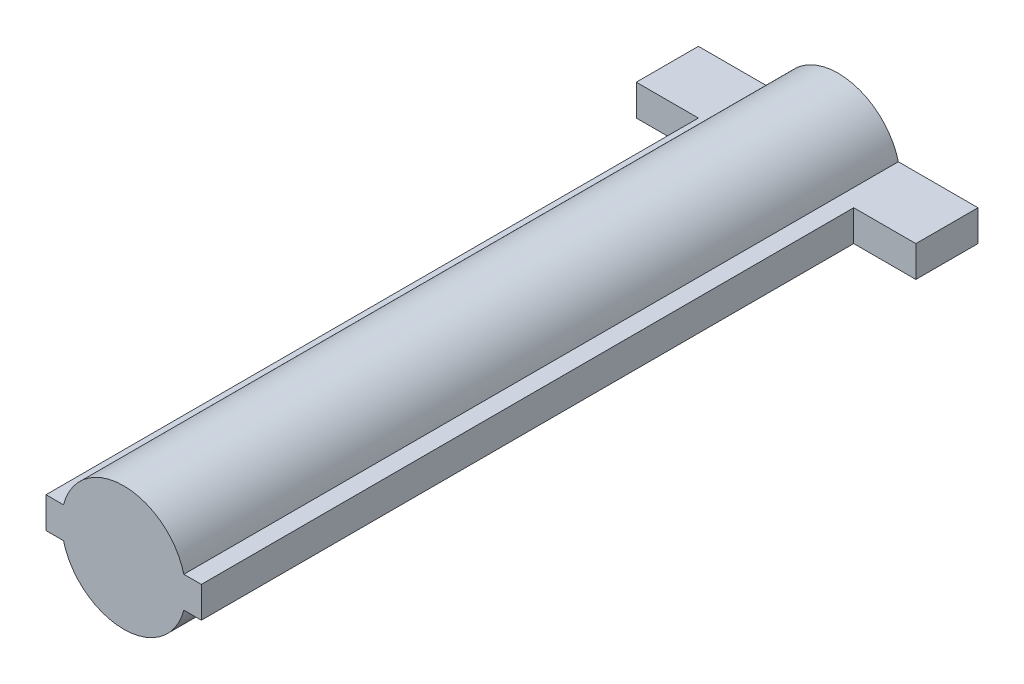
ISO-10303-21;
HEADER;
FILE_DESCRIPTION(('STEP AP214'),'2;1');
FILE_NAME('part.step','',(''),(''),'','','');
FILE_SCHEMA(('AUTOMOTIVE_DESIGN { 1 0 10303 214 1 1 1 1 }'));
ENDSEC;
DATA;
#1=APPLICATION_CONTEXT('core data for automotive mechanical design processes');
#2=APPLICATION_PROTOCOL_DEFINITION('international standard','automotive_design',2000,#1);
#3=PRODUCT_CONTEXT('',#1,'mechanical');
#4=PRODUCT('Part','Part','',(#3));
#5=PRODUCT_RELATED_PRODUCT_CATEGORY('part','',(#4));
#6=PRODUCT_DEFINITION_FORMATION('','',#4);
#7=PRODUCT_DEFINITION_CONTEXT('part definition',#1,'design');
#8=PRODUCT_DEFINITION('design','',#6,#7);
#9=PRODUCT_DEFINITION_SHAPE('','',#8);
#10=(LENGTH_UNIT() NAMED_UNIT(*) SI_UNIT(.MILLI.,.METRE.));
#11=(NAMED_UNIT(*) PLANE_ANGLE_UNIT() SI_UNIT($,.RADIAN.));
#12=(NAMED_UNIT(*) SI_UNIT($,.STERADIAN.) SOLID_ANGLE_UNIT());
#13=UNCERTAINTY_MEASURE_WITH_UNIT(LENGTH_MEASURE(1.E-05),#10,'distance_accuracy_value','');
#14=(GEOMETRIC_REPRESENTATION_CONTEXT(3) GLOBAL_UNCERTAINTY_ASSIGNED_CONTEXT((#13)) GLOBAL_UNIT_ASSIGNED_CONTEXT((#10,
#11,#12)) REPRESENTATION_CONTEXT('',''));
#15=CARTESIAN_POINT('',(0.,0.,0.));
#16=DIRECTION('',(0.,0.,1.));
#17=DIRECTION('',(1.,0.,0.));
#18=AXIS2_PLACEMENT_3D('',#15,#16,#17);
#19=CARTESIAN_POINT('',(0.,0.,2.));
#20=DIRECTION('',(0.,0.,1.));
#21=DIRECTION('',(1.,0.,0.));
#22=AXIS2_PLACEMENT_3D('',#19,#20,#21);
#23=PLANE('',#22);
#24=DIRECTION('',(0.,1.,0.));
#25=VECTOR('',#24,1.);
#26=CARTESIAN_POINT('',(2.5,-0.5,2.));
#27=LINE('',#26,#25);
#28=CARTESIAN_POINT('',(2.5,-0.5,2.));
#29=VERTEX_POINT('',#28);
#30=CARTESIAN_POINT('',(2.5,0.5,2.));
#31=VERTEX_POINT('',#30);
#32=EDGE_CURVE('E146',#29,#31,#27,.T.);
#33=ORIENTED_EDGE('',*,*,#32,.F.);
#34=DIRECTION('',(1.,0.,0.));
#35=VECTOR('',#34,1.);
#36=CARTESIAN_POINT('',(1.93649167310371,-0.5,2.));
#37=LINE('',#36,#35);
#38=CARTESIAN_POINT('',(4.5,-0.500000000000001,2.));
#39=VERTEX_POINT('',#38);
#40=EDGE_CURVE('E172',#29,#39,#37,.T.);
#41=ORIENTED_EDGE('',*,*,#40,.T.);
#42=DIRECTION('',(0.,1.,0.));
#43=VECTOR('',#42,1.);
#44=CARTESIAN_POINT('',(4.5,-0.500000000000001,2.));
#45=LINE('',#44,#43);
#46=CARTESIAN_POINT('',(4.5,0.499999999999999,2.));
#47=VERTEX_POINT('',#46);
#48=EDGE_CURVE('E174',#39,#47,#45,.T.);
#49=ORIENTED_EDGE('',*,*,#48,.T.);
#50=DIRECTION('',(-1.,0.,0.));
#51=VECTOR('',#50,1.);
#52=CARTESIAN_POINT('',(1.93649167310371,0.5,2.));
#53=LINE('',#52,#51);
#54=EDGE_CURVE('E177',#47,#31,#53,.T.);
#55=ORIENTED_EDGE('',*,*,#54,.T.);
#56=EDGE_LOOP('',(#33,#41,#49,#55));
#57=FACE_BOUND('',#56,.T.);
#58=ADVANCED_FACE('F33',(#57),#23,.T.);
#59=CARTESIAN_POINT('',(0.,0.,2.));
#60=DIRECTION('',(0.,0.,-1.));
#61=DIRECTION('',(-1.,0.,0.));
#62=AXIS2_PLACEMENT_3D('',#59,#60,#61);
#63=CYLINDRICAL_SURFACE('',#62,2.);
#64=DIRECTION('',(0.,0.,-1.));
#65=VECTOR('',#64,1.);
#66=CARTESIAN_POINT('',(-1.93649167310371,-0.5,2.));
#67=LINE('',#66,#65);
#68=CARTESIAN_POINT('',(-1.93649167310371,-0.5,23.));
#69=VERTEX_POINT('',#68);
#70=CARTESIAN_POINT('',(-1.93649167310371,-0.5,0.));
#71=VERTEX_POINT('',#70);
#72=EDGE_CURVE('E186',#69,#71,#67,.T.);
#73=ORIENTED_EDGE('',*,*,#72,.T.);
#74=CARTESIAN_POINT('',(0.,0.,0.));
#75=DIRECTION('',(0.,0.,1.));
#76=DIRECTION('',(1.,0.,0.));
#77=AXIS2_PLACEMENT_3D('',#74,#75,#76);
#78=CIRCLE('',#77,2.);
#79=CARTESIAN_POINT('',(1.93649167310371,-0.5,0.));
#80=VERTEX_POINT('',#79);
#81=EDGE_CURVE('E171',#71,#80,#78,.T.);
#82=ORIENTED_EDGE('',*,*,#81,.T.);
#83=DIRECTION('',(0.,0.,-1.));
#84=VECTOR('',#83,1.);
#85=CARTESIAN_POINT('',(1.93649167310371,-0.5,2.));
#86=LINE('',#85,#84);
#87=CARTESIAN_POINT('',(1.93649167310371,-0.500000000000001,23.));
#88=VERTEX_POINT('',#87);
#89=EDGE_CURVE('E11',#88,#80,#86,.T.);
#90=ORIENTED_EDGE('',*,*,#89,.F.);
#91=CARTESIAN_POINT('',(0.,0.,23.));
#92=DIRECTION('',(0.,0.,1.));
#93=DIRECTION('',(1.,0.,0.));
#94=AXIS2_PLACEMENT_3D('',#91,#92,#93);
#95=CIRCLE('',#94,2.);
#96=EDGE_CURVE('E156',#69,#88,#95,.T.);
#97=ORIENTED_EDGE('',*,*,#96,.F.);
#98=EDGE_LOOP('',(#73,#82,#90,#97));
#99=FACE_BOUND('',#98,.T.);
#100=ADVANCED_FACE('F35',(#99),#63,.T.);
#101=CARTESIAN_POINT('',(1.93649167310371,-0.5,2.));
#102=DIRECTION('',(0.,1.,0.));
#103=DIRECTION('',(-1.,0.,0.));
#104=AXIS2_PLACEMENT_3D('',#101,#102,#103);
#105=PLANE('',#104);
#106=ORIENTED_EDGE('',*,*,#89,.T.);
#107=DIRECTION('',(1.,0.,0.));
#108=VECTOR('',#107,1.);
#109=CARTESIAN_POINT('',(1.93649167310371,-0.5,0.));
#110=LINE('',#109,#108);
#111=CARTESIAN_POINT('',(4.5,-0.500000000000001,0.));
#112=VERTEX_POINT('',#111);
#113=EDGE_CURVE('E189',#80,#112,#110,.T.);
#114=ORIENTED_EDGE('',*,*,#113,.T.);
#115=DIRECTION('',(0.,0.,-1.));
#116=VECTOR('',#115,1.);
#117=CARTESIAN_POINT('',(4.5,-0.500000000000001,2.));
#118=LINE('',#117,#116);
#119=EDGE_CURVE('E41',#39,#112,#118,.T.);
#120=ORIENTED_EDGE('',*,*,#119,.F.);
#121=ORIENTED_EDGE('',*,*,#40,.F.);
#122=DIRECTION('',(0.,0.,-1.));
#123=VECTOR('',#122,1.);
#124=CARTESIAN_POINT('',(2.5,-0.5,23.));
#125=LINE('',#124,#123);
#126=CARTESIAN_POINT('',(2.5,-0.5,23.));
#127=VERTEX_POINT('',#126);
#128=EDGE_CURVE('E166',#127,#29,#125,.T.);
#129=ORIENTED_EDGE('',*,*,#128,.F.);
#130=DIRECTION('',(1.,0.,0.));
#131=VECTOR('',#130,1.);
#132=CARTESIAN_POINT('',(1.93649167310371,-0.5,23.));
#133=LINE('',#132,#131);
#134=EDGE_CURVE('E159',#88,#127,#133,.T.);
#135=ORIENTED_EDGE('',*,*,#134,.F.);
#136=EDGE_LOOP('',(#106,#114,#120,#121,#129,#135));
#137=FACE_BOUND('',#136,.T.);
#138=ADVANCED_FACE('F234',(#137),#105,.F.);
#139=CARTESIAN_POINT('',(4.5,-0.500000000000001,2.));
#140=DIRECTION('',(-1.,0.,0.));
#141=DIRECTION('',(0.,0.,1.));
#142=AXIS2_PLACEMENT_3D('',#139,#140,#141);
#143=PLANE('',#142);
#144=DIRECTION('',(0.,1.,0.));
#145=VECTOR('',#144,1.);
#146=CARTESIAN_POINT('',(4.5,-0.500000000000001,0.));
#147=LINE('',#146,#145);
#148=CARTESIAN_POINT('',(4.5,0.499999999999999,0.));
#149=VERTEX_POINT('',#148);
#150=EDGE_CURVE('E191',#112,#149,#147,.T.);
#151=ORIENTED_EDGE('',*,*,#150,.T.);
#152=DIRECTION('',(0.,0.,-1.));
#153=VECTOR('',#152,1.);
#154=CARTESIAN_POINT('',(4.5,0.499999999999999,2.));
#155=LINE('',#154,#153);
#156=EDGE_CURVE('E210',#47,#149,#155,.T.);
#157=ORIENTED_EDGE('',*,*,#156,.F.);
#158=ORIENTED_EDGE('',*,*,#48,.F.);
#159=ORIENTED_EDGE('',*,*,#119,.T.);
#160=EDGE_LOOP('',(#151,#157,#158,#159));
#161=FACE_BOUND('',#160,.T.);
#162=ADVANCED_FACE('F217',(#161),#143,.F.);
#163=CARTESIAN_POINT('',(1.93649167310371,0.5,2.));
#164=DIRECTION('',(0.,-1.,0.));
#165=DIRECTION('',(1.,0.,0.));
#166=AXIS2_PLACEMENT_3D('',#163,#164,#165);
#167=PLANE('',#166);
#168=DIRECTION('',(0.,0.,-1.));
#169=VECTOR('',#168,1.);
#170=CARTESIAN_POINT('',(2.5,0.5,23.));
#171=LINE('',#170,#169);
#172=CARTESIAN_POINT('',(2.5,0.5,23.));
#173=VERTEX_POINT('',#172);
#174=EDGE_CURVE('E56',#173,#31,#171,.T.);
#175=ORIENTED_EDGE('',*,*,#174,.T.);
#176=ORIENTED_EDGE('',*,*,#54,.F.);
#177=ORIENTED_EDGE('',*,*,#156,.T.);
#178=DIRECTION('',(-1.,0.,0.));
#179=VECTOR('',#178,1.);
#180=CARTESIAN_POINT('',(1.93649167310371,0.5,0.));
#181=LINE('',#180,#179);
#182=CARTESIAN_POINT('',(1.93649167310371,0.5,0.));
#183=VERTEX_POINT('',#182);
#184=EDGE_CURVE('E193',#149,#183,#181,.T.);
#185=ORIENTED_EDGE('',*,*,#184,.T.);
#186=DIRECTION('',(0.,0.,-1.));
#187=VECTOR('',#186,1.);
#188=CARTESIAN_POINT('',(1.93649167310371,0.5,2.));
#189=LINE('',#188,#187);
#190=CARTESIAN_POINT('',(1.93649167310371,0.5,23.));
#191=VERTEX_POINT('',#190);
#192=EDGE_CURVE('E134',#191,#183,#189,.T.);
#193=ORIENTED_EDGE('',*,*,#192,.F.);
#194=DIRECTION('',(-1.,0.,0.));
#195=VECTOR('',#194,1.);
#196=CARTESIAN_POINT('',(1.93649167310371,0.5,23.));
#197=LINE('',#196,#195);
#198=EDGE_CURVE('E145',#173,#191,#197,.T.);
#199=ORIENTED_EDGE('',*,*,#198,.F.);
#200=EDGE_LOOP('',(#175,#176,#177,#185,#193,#199));
#201=FACE_BOUND('',#200,.T.);
#202=ADVANCED_FACE('F226',(#201),#167,.F.);
#203=CARTESIAN_POINT('',(0.,0.,2.));
#204=DIRECTION('',(0.,0.,-1.));
#205=DIRECTION('',(-1.,0.,0.));
#206=AXIS2_PLACEMENT_3D('',#203,#204,#205);
#207=CYLINDRICAL_SURFACE('',#206,2.);
#208=ORIENTED_EDGE('',*,*,#192,.T.);
#209=CARTESIAN_POINT('',(0.,0.,0.));
#210=DIRECTION('',(0.,0.,1.));
#211=DIRECTION('',(1.,0.,0.));
#212=AXIS2_PLACEMENT_3D('',#209,#210,#211);
#213=CIRCLE('',#212,2.);
#214=CARTESIAN_POINT('',(-1.93649167310371,0.5,0.));
#215=VERTEX_POINT('',#214);
#216=EDGE_CURVE('E131',#183,#215,#213,.T.);
#217=ORIENTED_EDGE('',*,*,#216,.T.);
#218=DIRECTION('',(0.,0.,-1.));
#219=VECTOR('',#218,1.);
#220=CARTESIAN_POINT('',(-1.93649167310371,0.5,2.));
#221=LINE('',#220,#219);
#222=CARTESIAN_POINT('',(-1.93649167310371,0.5,23.));
#223=VERTEX_POINT('',#222);
#224=EDGE_CURVE('E125',#223,#215,#221,.T.);
#225=ORIENTED_EDGE('',*,*,#224,.F.);
#226=CARTESIAN_POINT('',(0.,0.,23.));
#227=DIRECTION('',(0.,0.,1.));
#228=DIRECTION('',(1.,0.,0.));
#229=AXIS2_PLACEMENT_3D('',#226,#227,#228);
#230=CIRCLE('',#229,2.);
#231=EDGE_CURVE('E129',#191,#223,#230,.T.);
#232=ORIENTED_EDGE('',*,*,#231,.F.);
#233=EDGE_LOOP('',(#208,#217,#225,#232));
#234=FACE_BOUND('',#233,.T.);
#235=ADVANCED_FACE('F127',(#234),#207,.T.);
#236=CARTESIAN_POINT('',(-4.5,0.499999999999999,2.));
#237=DIRECTION('',(0.,-1.,0.));
#238=DIRECTION('',(1.,0.,0.));
#239=AXIS2_PLACEMENT_3D('',#236,#237,#238);
#240=PLANE('',#239);
#241=ORIENTED_EDGE('',*,*,#224,.T.);
#242=DIRECTION('',(-1.,0.,0.));
#243=VECTOR('',#242,1.);
#244=CARTESIAN_POINT('',(-4.5,0.499999999999999,0.));
#245=LINE('',#244,#243);
#246=CARTESIAN_POINT('',(-4.5,0.499999999999999,0.));
#247=VERTEX_POINT('',#246);
#248=EDGE_CURVE('E197',#215,#247,#245,.T.);
#249=ORIENTED_EDGE('',*,*,#248,.T.);
#250=DIRECTION('',(0.,0.,-1.));
#251=VECTOR('',#250,1.);
#252=CARTESIAN_POINT('',(-4.5,0.499999999999999,2.));
#253=LINE('',#252,#251);
#254=CARTESIAN_POINT('',(-4.5,0.499999999999999,2.));
#255=VERTEX_POINT('',#254);
#256=EDGE_CURVE('E135',#255,#247,#253,.T.);
#257=ORIENTED_EDGE('',*,*,#256,.F.);
#258=DIRECTION('',(-1.,0.,0.));
#259=VECTOR('',#258,1.);
#260=CARTESIAN_POINT('',(-4.5,0.499999999999999,2.));
#261=LINE('',#260,#259);
#262=CARTESIAN_POINT('',(-2.5,0.5,2.));
#263=VERTEX_POINT('',#262);
#264=EDGE_CURVE('E179',#263,#255,#261,.T.);
#265=ORIENTED_EDGE('',*,*,#264,.F.);
#266=DIRECTION('',(0.,0.,-1.));
#267=VECTOR('',#266,1.);
#268=CARTESIAN_POINT('',(-2.5,0.5,23.));
#269=LINE('',#268,#267);
#270=CARTESIAN_POINT('',(-2.5,0.5,23.));
#271=VERTEX_POINT('',#270);
#272=EDGE_CURVE('E48',#271,#263,#269,.T.);
#273=ORIENTED_EDGE('',*,*,#272,.F.);
#274=DIRECTION('',(-1.,0.,0.));
#275=VECTOR('',#274,1.);
#276=CARTESIAN_POINT('',(-2.5,0.5,23.));
#277=LINE('',#276,#275);
#278=EDGE_CURVE('E137',#223,#271,#277,.T.);
#279=ORIENTED_EDGE('',*,*,#278,.F.);
#280=EDGE_LOOP('',(#241,#249,#257,#265,#273,#279));
#281=FACE_BOUND('',#280,.T.);
#282=ADVANCED_FACE('F138',(#281),#240,.F.);
#283=CARTESIAN_POINT('',(-4.5,-0.500000000000001,2.));
#284=DIRECTION('',(1.,0.,0.));
#285=DIRECTION('',(0.,0.,-1.));
#286=AXIS2_PLACEMENT_3D('',#283,#284,#285);
#287=PLANE('',#286);
#288=DIRECTION('',(0.,-1.,0.));
#289=VECTOR('',#288,1.);
#290=CARTESIAN_POINT('',(-4.5,-0.500000000000001,0.));
#291=LINE('',#290,#289);
#292=CARTESIAN_POINT('',(-4.5,-0.500000000000001,0.));
#293=VERTEX_POINT('',#292);
#294=EDGE_CURVE('E199',#247,#293,#291,.T.);
#295=ORIENTED_EDGE('',*,*,#294,.T.);
#296=DIRECTION('',(0.,0.,-1.));
#297=VECTOR('',#296,1.);
#298=CARTESIAN_POINT('',(-4.5,-0.500000000000001,2.));
#299=LINE('',#298,#297);
#300=CARTESIAN_POINT('',(-4.5,-0.500000000000001,2.));
#301=VERTEX_POINT('',#300);
#302=EDGE_CURVE('E204',#301,#293,#299,.T.);
#303=ORIENTED_EDGE('',*,*,#302,.F.);
#304=DIRECTION('',(0.,-1.,0.));
#305=VECTOR('',#304,1.);
#306=CARTESIAN_POINT('',(-4.5,-0.500000000000001,2.));
#307=LINE('',#306,#305);
#308=EDGE_CURVE('E181',#255,#301,#307,.T.);
#309=ORIENTED_EDGE('',*,*,#308,.F.);
#310=ORIENTED_EDGE('',*,*,#256,.T.);
#311=EDGE_LOOP('',(#295,#303,#309,#310));
#312=FACE_BOUND('',#311,.T.);
#313=ADVANCED_FACE('F246',(#312),#287,.F.);
#314=CARTESIAN_POINT('',(-4.5,-0.500000000000001,2.));
#315=DIRECTION('',(0.,1.,0.));
#316=DIRECTION('',(-1.,0.,0.));
#317=AXIS2_PLACEMENT_3D('',#314,#315,#316);
#318=PLANE('',#317);
#319=DIRECTION('',(0.,0.,-1.));
#320=VECTOR('',#319,1.);
#321=CARTESIAN_POINT('',(-2.5,-0.5,23.));
#322=LINE('',#321,#320);
#323=CARTESIAN_POINT('',(-2.5,-0.5,23.));
#324=VERTEX_POINT('',#323);
#325=CARTESIAN_POINT('',(-2.5,-0.5,2.));
#326=VERTEX_POINT('',#325);
#327=EDGE_CURVE('E168',#324,#326,#322,.T.);
#328=ORIENTED_EDGE('',*,*,#327,.T.);
#329=DIRECTION('',(1.,0.,0.));
#330=VECTOR('',#329,1.);
#331=CARTESIAN_POINT('',(-4.5,-0.500000000000001,2.));
#332=LINE('',#331,#330);
#333=EDGE_CURVE('E183',#301,#326,#332,.T.);
#334=ORIENTED_EDGE('',*,*,#333,.F.);
#335=ORIENTED_EDGE('',*,*,#302,.T.);
#336=DIRECTION('',(1.,0.,0.));
#337=VECTOR('',#336,1.);
#338=CARTESIAN_POINT('',(-4.5,-0.500000000000001,0.));
#339=LINE('',#338,#337);
#340=EDGE_CURVE('E175',#293,#71,#339,.T.);
#341=ORIENTED_EDGE('',*,*,#340,.T.);
#342=ORIENTED_EDGE('',*,*,#72,.F.);
#343=DIRECTION('',(1.,0.,0.));
#344=VECTOR('',#343,1.);
#345=CARTESIAN_POINT('',(-2.5,-0.5,23.));
#346=LINE('',#345,#344);
#347=EDGE_CURVE('E153',#324,#69,#346,.T.);
#348=ORIENTED_EDGE('',*,*,#347,.F.);
#349=EDGE_LOOP('',(#328,#334,#335,#341,#342,#348));
#350=FACE_BOUND('',#349,.T.);
#351=ADVANCED_FACE('F241',(#350),#318,.F.);
#352=DIRECTION('',(0.,-1.,0.));
#353=VECTOR('',#352,1.);
#354=CARTESIAN_POINT('',(-2.5,-0.5,2.));
#355=LINE('',#354,#353);
#356=EDGE_CURVE('E149',#263,#326,#355,.T.);
#357=ORIENTED_EDGE('',*,*,#356,.F.);
#358=ORIENTED_EDGE('',*,*,#264,.T.);
#359=ORIENTED_EDGE('',*,*,#308,.T.);
#360=ORIENTED_EDGE('',*,*,#333,.T.);
#361=EDGE_LOOP('',(#357,#358,#359,#360));
#362=FACE_BOUND('',#361,.T.);
#363=ADVANCED_FACE('F249',(#362),#23,.T.);
#364=CARTESIAN_POINT('',(0.,0.,0.));
#365=DIRECTION('',(0.,0.,1.));
#366=DIRECTION('',(1.,0.,0.));
#367=AXIS2_PLACEMENT_3D('',#364,#365,#366);
#368=PLANE('',#367);
#369=ORIENTED_EDGE('',*,*,#81,.F.);
#370=ORIENTED_EDGE('',*,*,#340,.F.);
#371=ORIENTED_EDGE('',*,*,#294,.F.);
#372=ORIENTED_EDGE('',*,*,#248,.F.);
#373=ORIENTED_EDGE('',*,*,#216,.F.);
#374=ORIENTED_EDGE('',*,*,#184,.F.);
#375=ORIENTED_EDGE('',*,*,#150,.F.);
#376=ORIENTED_EDGE('',*,*,#113,.F.);
#377=EDGE_LOOP('',(#369,#370,#371,#372,#373,#374,#375,#376));
#378=FACE_BOUND('',#377,.T.);
#379=ADVANCED_FACE('F225',(#378),#368,.F.);
#380=CARTESIAN_POINT('',(-2.5,-0.5,23.));
#381=DIRECTION('',(1.,0.,0.));
#382=DIRECTION('',(0.,0.,-1.));
#383=AXIS2_PLACEMENT_3D('',#380,#381,#382);
#384=PLANE('',#383);
#385=ORIENTED_EDGE('',*,*,#272,.T.);
#386=ORIENTED_EDGE('',*,*,#356,.T.);
#387=ORIENTED_EDGE('',*,*,#327,.F.);
#388=DIRECTION('',(0.,-1.,0.));
#389=VECTOR('',#388,1.);
#390=CARTESIAN_POINT('',(-2.5,-0.5,23.));
#391=LINE('',#390,#389);
#392=EDGE_CURVE('E141',#271,#324,#391,.T.);
#393=ORIENTED_EDGE('',*,*,#392,.F.);
#394=EDGE_LOOP('',(#385,#386,#387,#393));
#395=FACE_BOUND('',#394,.T.);
#396=ADVANCED_FACE('F251',(#395),#384,.F.);
#397=CARTESIAN_POINT('',(2.5,-0.5,23.));
#398=DIRECTION('',(-1.,0.,0.));
#399=DIRECTION('',(0.,0.,1.));
#400=AXIS2_PLACEMENT_3D('',#397,#398,#399);
#401=PLANE('',#400);
#402=ORIENTED_EDGE('',*,*,#128,.T.);
#403=ORIENTED_EDGE('',*,*,#32,.T.);
#404=ORIENTED_EDGE('',*,*,#174,.F.);
#405=DIRECTION('',(0.,1.,0.));
#406=VECTOR('',#405,1.);
#407=CARTESIAN_POINT('',(2.5,-0.5,23.));
#408=LINE('',#407,#406);
#409=EDGE_CURVE('E161',#127,#173,#408,.T.);
#410=ORIENTED_EDGE('',*,*,#409,.F.);
#411=EDGE_LOOP('',(#402,#403,#404,#410));
#412=FACE_BOUND('',#411,.T.);
#413=ADVANCED_FACE('F230',(#412),#401,.F.);
#414=CARTESIAN_POINT('',(0.,0.,23.));
#415=DIRECTION('',(0.,0.,1.));
#416=DIRECTION('',(1.,0.,0.));
#417=AXIS2_PLACEMENT_3D('',#414,#415,#416);
#418=PLANE('',#417);
#419=ORIENTED_EDGE('',*,*,#231,.T.);
#420=ORIENTED_EDGE('',*,*,#278,.T.);
#421=ORIENTED_EDGE('',*,*,#392,.T.);
#422=ORIENTED_EDGE('',*,*,#347,.T.);
#423=ORIENTED_EDGE('',*,*,#96,.T.);
#424=ORIENTED_EDGE('',*,*,#134,.T.);
#425=ORIENTED_EDGE('',*,*,#409,.T.);
#426=ORIENTED_EDGE('',*,*,#198,.T.);
#427=EDGE_LOOP('',(#419,#420,#421,#422,#423,#424,#425,#426));
#428=FACE_BOUND('',#427,.T.);
#429=ADVANCED_FACE('F144',(#428),#418,.T.);
#430=CLOSED_SHELL('',(#58,#100,#138,#162,#202,#235,#282,#313,#351,#363,#379,#396,#413,#429));
#431=MANIFOLD_SOLID_BREP('B2',#430);
#432=ADVANCED_BREP_SHAPE_REPRESENTATION('',(#18,#431),#14);
#433=SHAPE_DEFINITION_REPRESENTATION(#9,#432);
ENDSEC;
END-ISO-10303-21;
